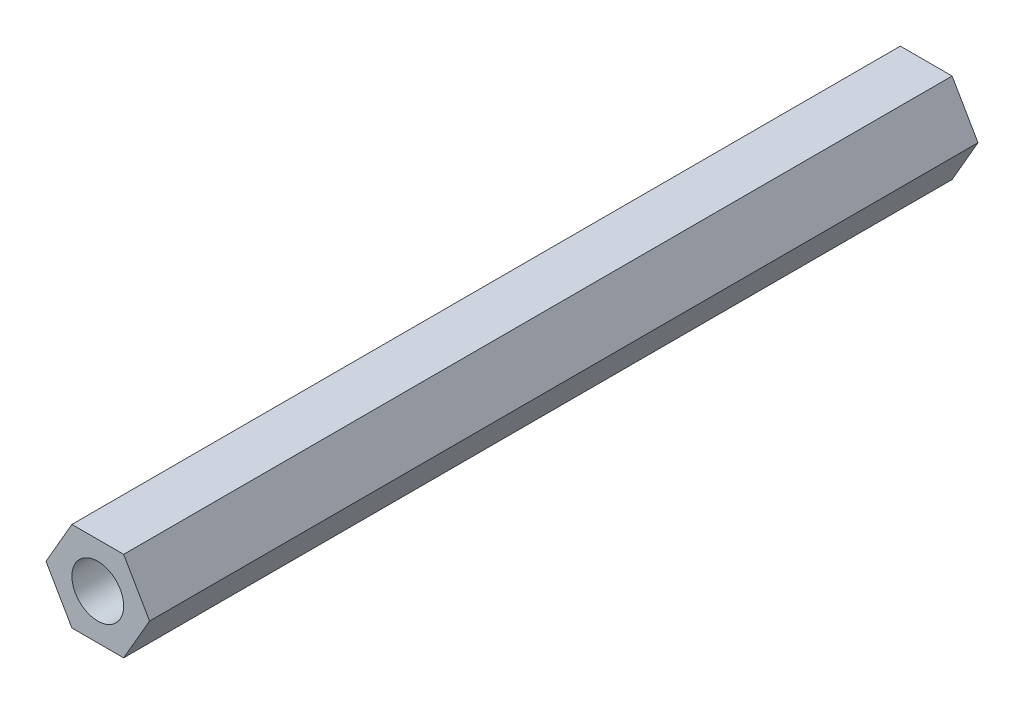
ISO-10303-21;
HEADER;
FILE_DESCRIPTION(('STEP AP214'),'2;1');
FILE_NAME('part.step','',(''),(''),'','','');
FILE_SCHEMA(('AUTOMOTIVE_DESIGN { 1 0 10303 214 1 1 1 1 }'));
ENDSEC;
DATA;
#1=APPLICATION_CONTEXT('core data for automotive mechanical design processes');
#2=APPLICATION_PROTOCOL_DEFINITION('international standard','automotive_design',2000,#1);
#3=PRODUCT_CONTEXT('',#1,'mechanical');
#4=PRODUCT('Part','Part','',(#3));
#5=PRODUCT_RELATED_PRODUCT_CATEGORY('part','',(#4));
#6=PRODUCT_DEFINITION_FORMATION('','',#4);
#7=PRODUCT_DEFINITION_CONTEXT('part definition',#1,'design');
#8=PRODUCT_DEFINITION('design','',#6,#7);
#9=PRODUCT_DEFINITION_SHAPE('','',#8);
#10=(LENGTH_UNIT() NAMED_UNIT(*) SI_UNIT(.MILLI.,.METRE.));
#11=(NAMED_UNIT(*) PLANE_ANGLE_UNIT() SI_UNIT($,.RADIAN.));
#12=(NAMED_UNIT(*) SI_UNIT($,.STERADIAN.) SOLID_ANGLE_UNIT());
#13=UNCERTAINTY_MEASURE_WITH_UNIT(LENGTH_MEASURE(1.E-05),#10,'distance_accuracy_value','');
#14=(GEOMETRIC_REPRESENTATION_CONTEXT(3) GLOBAL_UNCERTAINTY_ASSIGNED_CONTEXT((#13)) GLOBAL_UNIT_ASSIGNED_CONTEXT((#10,
#11,#12)) REPRESENTATION_CONTEXT('',''));
#15=CARTESIAN_POINT('',(0.,0.,0.));
#16=DIRECTION('',(0.,0.,1.));
#17=DIRECTION('',(1.,0.,0.));
#18=AXIS2_PLACEMENT_3D('',#15,#16,#17);
#19=CARTESIAN_POINT('',(-1.25,-2.1650635094611,40.));
#20=DIRECTION('',(0.866025403784439,-0.5,0.));
#21=DIRECTION('',(0.5,0.866025403784439,0.));
#22=AXIS2_PLACEMENT_3D('',#19,#20,#21);
#23=PLANE('',#22);
#24=DIRECTION('',(-0.5,-0.866025403784439,0.));
#25=VECTOR('',#24,1.);
#26=CARTESIAN_POINT('',(-1.25,-2.1650635094611,0.));
#27=LINE('',#26,#25);
#28=CARTESIAN_POINT('',(0.,0.,0.));
#29=VERTEX_POINT('',#28);
#30=CARTESIAN_POINT('',(-1.25,-2.1650635094611,0.));
#31=VERTEX_POINT('',#30);
#32=EDGE_CURVE('E130',#29,#31,#27,.T.);
#33=ORIENTED_EDGE('',*,*,#32,.T.);
#34=DIRECTION('',(0.,0.,-1.));
#35=VECTOR('',#34,1.);
#36=CARTESIAN_POINT('',(-1.25,-2.1650635094611,40.));
#37=LINE('',#36,#35);
#38=CARTESIAN_POINT('',(-1.25,-2.1650635094611,40.));
#39=VERTEX_POINT('',#38);
#40=EDGE_CURVE('E11',#39,#31,#37,.T.);
#41=ORIENTED_EDGE('',*,*,#40,.F.);
#42=DIRECTION('',(-0.5,-0.866025403784439,0.));
#43=VECTOR('',#42,1.);
#44=CARTESIAN_POINT('',(-1.25,-2.1650635094611,40.));
#45=LINE('',#44,#43);
#46=CARTESIAN_POINT('',(0.,0.,40.));
#47=VERTEX_POINT('',#46);
#48=EDGE_CURVE('E147',#47,#39,#45,.T.);
#49=ORIENTED_EDGE('',*,*,#48,.F.);
#50=DIRECTION('',(0.,0.,-1.));
#51=VECTOR('',#50,1.);
#52=CARTESIAN_POINT('',(0.,0.,40.));
#53=LINE('',#52,#51);
#54=EDGE_CURVE('E126',#47,#29,#53,.T.);
#55=ORIENTED_EDGE('',*,*,#54,.T.);
#56=EDGE_LOOP('',(#33,#41,#49,#55));
#57=FACE_BOUND('',#56,.T.);
#58=ADVANCED_FACE('F41',(#57),#23,.F.);
#59=CARTESIAN_POINT('',(0.,-4.33012701892219,40.));
#60=DIRECTION('',(0.866025403784439,0.5,0.));
#61=DIRECTION('',(-0.5,0.866025403784439,0.));
#62=AXIS2_PLACEMENT_3D('',#59,#60,#61);
#63=PLANE('',#62);
#64=DIRECTION('',(0.5,-0.866025403784439,0.));
#65=VECTOR('',#64,1.);
#66=CARTESIAN_POINT('',(0.,-4.33012701892219,0.));
#67=LINE('',#66,#65);
#68=CARTESIAN_POINT('',(0.,-4.33012701892219,0.));
#69=VERTEX_POINT('',#68);
#70=EDGE_CURVE('E134',#31,#69,#67,.T.);
#71=ORIENTED_EDGE('',*,*,#70,.T.);
#72=DIRECTION('',(0.,0.,-1.));
#73=VECTOR('',#72,1.);
#74=CARTESIAN_POINT('',(0.,-4.33012701892219,40.));
#75=LINE('',#74,#73);
#76=CARTESIAN_POINT('',(0.,-4.33012701892219,40.));
#77=VERTEX_POINT('',#76);
#78=EDGE_CURVE('E50',#77,#69,#75,.T.);
#79=ORIENTED_EDGE('',*,*,#78,.F.);
#80=DIRECTION('',(0.5,-0.866025403784439,0.));
#81=VECTOR('',#80,1.);
#82=CARTESIAN_POINT('',(0.,-4.33012701892219,40.));
#83=LINE('',#82,#81);
#84=EDGE_CURVE('E95',#39,#77,#83,.T.);
#85=ORIENTED_EDGE('',*,*,#84,.F.);
#86=ORIENTED_EDGE('',*,*,#40,.T.);
#87=EDGE_LOOP('',(#71,#79,#85,#86));
#88=FACE_BOUND('',#87,.T.);
#89=ADVANCED_FACE('F176',(#88),#63,.F.);
#90=CARTESIAN_POINT('',(2.5,-4.33012701892219,40.));
#91=DIRECTION('',(0.,1.,0.));
#92=DIRECTION('',(0.,0.,1.));
#93=AXIS2_PLACEMENT_3D('',#90,#91,#92);
#94=PLANE('',#93);
#95=DIRECTION('',(1.,0.,0.));
#96=VECTOR('',#95,1.);
#97=CARTESIAN_POINT('',(2.5,-4.33012701892219,0.));
#98=LINE('',#97,#96);
#99=CARTESIAN_POINT('',(2.5,-4.33012701892219,0.));
#100=VERTEX_POINT('',#99);
#101=EDGE_CURVE('E138',#69,#100,#98,.T.);
#102=ORIENTED_EDGE('',*,*,#101,.T.);
#103=DIRECTION('',(0.,0.,-1.));
#104=VECTOR('',#103,1.);
#105=CARTESIAN_POINT('',(2.5,-4.33012701892219,40.));
#106=LINE('',#105,#104);
#107=CARTESIAN_POINT('',(2.5,-4.33012701892219,40.));
#108=VERTEX_POINT('',#107);
#109=EDGE_CURVE('E119',#108,#100,#106,.T.);
#110=ORIENTED_EDGE('',*,*,#109,.F.);
#111=DIRECTION('',(1.,0.,0.));
#112=VECTOR('',#111,1.);
#113=CARTESIAN_POINT('',(2.5,-4.33012701892219,40.));
#114=LINE('',#113,#112);
#115=EDGE_CURVE('E108',#77,#108,#114,.T.);
#116=ORIENTED_EDGE('',*,*,#115,.F.);
#117=ORIENTED_EDGE('',*,*,#78,.T.);
#118=EDGE_LOOP('',(#102,#110,#116,#117));
#119=FACE_BOUND('',#118,.T.);
#120=ADVANCED_FACE('F157',(#119),#94,.F.);
#121=CARTESIAN_POINT('',(3.75,-2.1650635094611,40.));
#122=DIRECTION('',(-0.866025403784439,0.5,0.));
#123=DIRECTION('',(-0.5,-0.866025403784439,0.));
#124=AXIS2_PLACEMENT_3D('',#121,#122,#123);
#125=PLANE('',#124);
#126=DIRECTION('',(0.5,0.866025403784439,0.));
#127=VECTOR('',#126,1.);
#128=CARTESIAN_POINT('',(3.75,-2.1650635094611,0.));
#129=LINE('',#128,#127);
#130=CARTESIAN_POINT('',(3.75,-2.1650635094611,0.));
#131=VERTEX_POINT('',#130);
#132=EDGE_CURVE('E117',#100,#131,#129,.T.);
#133=ORIENTED_EDGE('',*,*,#132,.T.);
#134=DIRECTION('',(0.,0.,-1.));
#135=VECTOR('',#134,1.);
#136=CARTESIAN_POINT('',(3.75,-2.1650635094611,40.));
#137=LINE('',#136,#135);
#138=CARTESIAN_POINT('',(3.75,-2.1650635094611,40.));
#139=VERTEX_POINT('',#138);
#140=EDGE_CURVE('E114',#139,#131,#137,.T.);
#141=ORIENTED_EDGE('',*,*,#140,.F.);
#142=DIRECTION('',(0.5,0.866025403784439,0.));
#143=VECTOR('',#142,1.);
#144=CARTESIAN_POINT('',(3.75,-2.1650635094611,40.));
#145=LINE('',#144,#143);
#146=EDGE_CURVE('E102',#108,#139,#145,.T.);
#147=ORIENTED_EDGE('',*,*,#146,.F.);
#148=ORIENTED_EDGE('',*,*,#109,.T.);
#149=EDGE_LOOP('',(#133,#141,#147,#148));
#150=FACE_BOUND('',#149,.T.);
#151=ADVANCED_FACE('F115',(#150),#125,.F.);
#152=CARTESIAN_POINT('',(2.5,0.,40.));
#153=DIRECTION('',(-0.866025403784439,-0.5,0.));
#154=DIRECTION('',(0.5,-0.866025403784439,0.));
#155=AXIS2_PLACEMENT_3D('',#152,#153,#154);
#156=PLANE('',#155);
#157=DIRECTION('',(-0.5,0.866025403784439,0.));
#158=VECTOR('',#157,1.);
#159=CARTESIAN_POINT('',(2.5,0.,0.));
#160=LINE('',#159,#158);
#161=CARTESIAN_POINT('',(2.5,0.,0.));
#162=VERTEX_POINT('',#161);
#163=EDGE_CURVE('E81',#131,#162,#160,.T.);
#164=ORIENTED_EDGE('',*,*,#163,.T.);
#165=DIRECTION('',(0.,0.,-1.));
#166=VECTOR('',#165,1.);
#167=CARTESIAN_POINT('',(2.5,0.,40.));
#168=LINE('',#167,#166);
#169=CARTESIAN_POINT('',(2.5,0.,40.));
#170=VERTEX_POINT('',#169);
#171=EDGE_CURVE('E120',#170,#162,#168,.T.);
#172=ORIENTED_EDGE('',*,*,#171,.F.);
#173=DIRECTION('',(-0.5,0.866025403784439,0.));
#174=VECTOR('',#173,1.);
#175=CARTESIAN_POINT('',(2.5,0.,40.));
#176=LINE('',#175,#174);
#177=EDGE_CURVE('E106',#139,#170,#176,.T.);
#178=ORIENTED_EDGE('',*,*,#177,.F.);
#179=ORIENTED_EDGE('',*,*,#140,.T.);
#180=EDGE_LOOP('',(#164,#172,#178,#179));
#181=FACE_BOUND('',#180,.T.);
#182=ADVANCED_FACE('F122',(#181),#156,.F.);
#183=CARTESIAN_POINT('',(0.,0.,40.));
#184=DIRECTION('',(0.,-1.,0.));
#185=DIRECTION('',(0.,0.,-1.));
#186=AXIS2_PLACEMENT_3D('',#183,#184,#185);
#187=PLANE('',#186);
#188=DIRECTION('',(-1.,0.,0.));
#189=VECTOR('',#188,1.);
#190=CARTESIAN_POINT('',(0.,0.,0.));
#191=LINE('',#190,#189);
#192=EDGE_CURVE('E87',#162,#29,#191,.T.);
#193=ORIENTED_EDGE('',*,*,#192,.T.);
#194=ORIENTED_EDGE('',*,*,#54,.F.);
#195=DIRECTION('',(-1.,0.,0.));
#196=VECTOR('',#195,1.);
#197=CARTESIAN_POINT('',(0.,0.,40.));
#198=LINE('',#197,#196);
#199=EDGE_CURVE('E58',#170,#47,#198,.T.);
#200=ORIENTED_EDGE('',*,*,#199,.F.);
#201=ORIENTED_EDGE('',*,*,#171,.T.);
#202=EDGE_LOOP('',(#193,#194,#200,#201));
#203=FACE_BOUND('',#202,.T.);
#204=ADVANCED_FACE('F164',(#203),#187,.F.);
#205=CARTESIAN_POINT('',(0.,0.,40.));
#206=DIRECTION('',(0.,0.,-1.));
#207=DIRECTION('',(-1.,0.,0.));
#208=AXIS2_PLACEMENT_3D('',#205,#206,#207);
#209=PLANE('',#208);
#210=CARTESIAN_POINT('',(1.25,-2.1650635094611,40.));
#211=DIRECTION('',(0.,0.,1.));
#212=DIRECTION('',(1.,0.,0.));
#213=AXIS2_PLACEMENT_3D('',#210,#211,#212);
#214=CIRCLE('',#213,1.24999999999999);
#215=CARTESIAN_POINT('',(2.49999999999999,-2.1650635094611,40.));
#216=VERTEX_POINT('',#215);
#217=EDGE_CURVE('E233',#216,#216,#214,.T.);
#218=ORIENTED_EDGE('',*,*,#217,.F.);
#219=EDGE_LOOP('',(#218));
#220=FACE_BOUND('',#219,.T.);
#221=ORIENTED_EDGE('',*,*,#48,.T.);
#222=ORIENTED_EDGE('',*,*,#84,.T.);
#223=ORIENTED_EDGE('',*,*,#115,.T.);
#224=ORIENTED_EDGE('',*,*,#146,.T.);
#225=ORIENTED_EDGE('',*,*,#177,.T.);
#226=ORIENTED_EDGE('',*,*,#199,.T.);
#227=EDGE_LOOP('',(#221,#222,#223,#224,#225,#226));
#228=FACE_BOUND('',#227,.T.);
#229=ADVANCED_FACE('F104',(#220,#228),#209,.F.);
#230=CARTESIAN_POINT('',(0.,0.,0.));
#231=DIRECTION('',(0.,0.,-1.));
#232=DIRECTION('',(-1.,0.,0.));
#233=AXIS2_PLACEMENT_3D('',#230,#231,#232);
#234=PLANE('',#233);
#235=CARTESIAN_POINT('',(1.25,-2.1650635094611,0.));
#236=DIRECTION('',(0.,0.,1.));
#237=DIRECTION('',(1.,0.,0.));
#238=AXIS2_PLACEMENT_3D('',#235,#236,#237);
#239=CIRCLE('',#238,1.24999999999999);
#240=CARTESIAN_POINT('',(2.49999999999999,-2.1650635094611,0.));
#241=VERTEX_POINT('',#240);
#242=EDGE_CURVE('E135',#241,#241,#239,.T.);
#243=ORIENTED_EDGE('',*,*,#242,.T.);
#244=EDGE_LOOP('',(#243));
#245=FACE_BOUND('',#244,.T.);
#246=ORIENTED_EDGE('',*,*,#32,.F.);
#247=ORIENTED_EDGE('',*,*,#192,.F.);
#248=ORIENTED_EDGE('',*,*,#163,.F.);
#249=ORIENTED_EDGE('',*,*,#132,.F.);
#250=ORIENTED_EDGE('',*,*,#101,.F.);
#251=ORIENTED_EDGE('',*,*,#70,.F.);
#252=EDGE_LOOP('',(#246,#247,#248,#249,#250,#251));
#253=FACE_BOUND('',#252,.T.);
#254=ADVANCED_FACE('F160',(#245,#253),#234,.T.);
#255=CARTESIAN_POINT('',(1.25,-2.1650635094611,40.));
#256=DIRECTION('',(0.,0.,1.));
#257=DIRECTION('',(1.,0.,0.));
#258=AXIS2_PLACEMENT_3D('',#255,#256,#257);
#259=CYLINDRICAL_SURFACE('',#258,1.24999999999999);
#260=ORIENTED_EDGE('',*,*,#242,.F.);
#261=EDGE_LOOP('',(#260));
#262=FACE_BOUND('',#261,.T.);
#263=ORIENTED_EDGE('',*,*,#217,.T.);
#264=EDGE_LOOP('',(#263));
#265=FACE_BOUND('',#264,.T.);
#266=ADVANCED_FACE('F213',(#262,#265),#259,.F.);
#267=CLOSED_SHELL('',(#58,#89,#120,#151,#182,#204,#229,#254,#266));
#268=MANIFOLD_SOLID_BREP('B2',#267);
#269=ADVANCED_BREP_SHAPE_REPRESENTATION('',(#18,#268),#14);
#270=SHAPE_DEFINITION_REPRESENTATION(#9,#269);
ENDSEC;
END-ISO-10303-21;
